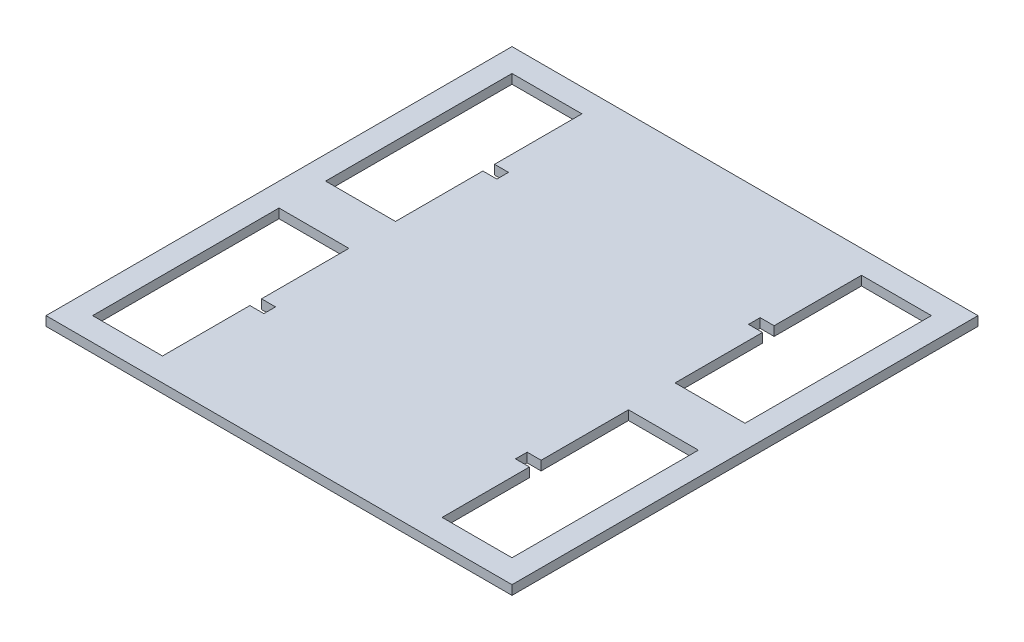
ISO-10303-21;
HEADER;
FILE_DESCRIPTION(('STEP AP214'),'2;1');
FILE_NAME('part.step','',(''),(''),'','','');
FILE_SCHEMA(('AUTOMOTIVE_DESIGN { 1 0 10303 214 1 1 1 1 }'));
ENDSEC;
DATA;
#1=APPLICATION_CONTEXT('core data for automotive mechanical design processes');
#2=APPLICATION_PROTOCOL_DEFINITION('international standard','automotive_design',2000,#1);
#3=PRODUCT_CONTEXT('',#1,'mechanical');
#4=PRODUCT('Part','Part','',(#3));
#5=PRODUCT_RELATED_PRODUCT_CATEGORY('part','',(#4));
#6=PRODUCT_DEFINITION_FORMATION('','',#4);
#7=PRODUCT_DEFINITION_CONTEXT('part definition',#1,'design');
#8=PRODUCT_DEFINITION('design','',#6,#7);
#9=PRODUCT_DEFINITION_SHAPE('','',#8);
#10=(LENGTH_UNIT() NAMED_UNIT(*) SI_UNIT(.MILLI.,.METRE.));
#11=(NAMED_UNIT(*) PLANE_ANGLE_UNIT() SI_UNIT($,.RADIAN.));
#12=(NAMED_UNIT(*) SI_UNIT($,.STERADIAN.) SOLID_ANGLE_UNIT());
#13=UNCERTAINTY_MEASURE_WITH_UNIT(LENGTH_MEASURE(1.E-05),#10,'distance_accuracy_value','');
#14=(GEOMETRIC_REPRESENTATION_CONTEXT(3) GLOBAL_UNCERTAINTY_ASSIGNED_CONTEXT((#13)) GLOBAL_UNIT_ASSIGNED_CONTEXT((#10,
#11,#12)) REPRESENTATION_CONTEXT('',''));
#15=CARTESIAN_POINT('',(0.,0.,0.));
#16=DIRECTION('',(0.,0.,1.));
#17=DIRECTION('',(1.,0.,0.));
#18=AXIS2_PLACEMENT_3D('',#15,#16,#17);
#19=CARTESIAN_POINT('',(0.,-8.,0.));
#20=DIRECTION('',(-1.,0.,0.));
#21=DIRECTION('',(0.,0.,1.));
#22=AXIS2_PLACEMENT_3D('',#19,#20,#21);
#23=PLANE('',#22);
#24=DIRECTION('',(0.,0.,1.));
#25=VECTOR('',#24,1.);
#26=CARTESIAN_POINT('',(0.,0.,0.));
#27=LINE('',#26,#25);
#28=CARTESIAN_POINT('',(0.,0.,-400.));
#29=VERTEX_POINT('',#28);
#30=CARTESIAN_POINT('',(0.,0.,0.));
#31=VERTEX_POINT('',#30);
#32=EDGE_CURVE('E486',#29,#31,#27,.T.);
#33=ORIENTED_EDGE('',*,*,#32,.F.);
#34=DIRECTION('',(0.,1.,0.));
#35=VECTOR('',#34,1.);
#36=CARTESIAN_POINT('',(0.,-8.,-400.));
#37=LINE('',#36,#35);
#38=CARTESIAN_POINT('',(0.,-8.,-400.));
#39=VERTEX_POINT('',#38);
#40=EDGE_CURVE('E11',#39,#29,#37,.T.);
#41=ORIENTED_EDGE('',*,*,#40,.F.);
#42=DIRECTION('',(0.,0.,1.));
#43=VECTOR('',#42,1.);
#44=CARTESIAN_POINT('',(0.,-8.,0.));
#45=LINE('',#44,#43);
#46=CARTESIAN_POINT('',(0.,-8.,0.));
#47=VERTEX_POINT('',#46);
#48=EDGE_CURVE('E487',#39,#47,#45,.T.);
#49=ORIENTED_EDGE('',*,*,#48,.T.);
#50=DIRECTION('',(0.,1.,0.));
#51=VECTOR('',#50,1.);
#52=CARTESIAN_POINT('',(0.,-8.,0.));
#53=LINE('',#52,#51);
#54=EDGE_CURVE('E42',#47,#31,#53,.T.);
#55=ORIENTED_EDGE('',*,*,#54,.T.);
#56=EDGE_LOOP('',(#33,#41,#49,#55));
#57=FACE_BOUND('',#56,.T.);
#58=ADVANCED_FACE('F39',(#57),#23,.T.);
#59=CARTESIAN_POINT('',(0.,-8.,-400.));
#60=DIRECTION('',(0.,0.,-1.));
#61=DIRECTION('',(-1.,0.,0.));
#62=AXIS2_PLACEMENT_3D('',#59,#60,#61);
#63=PLANE('',#62);
#64=DIRECTION('',(-1.,0.,0.));
#65=VECTOR('',#64,1.);
#66=CARTESIAN_POINT('',(0.,0.,-400.));
#67=LINE('',#66,#65);
#68=CARTESIAN_POINT('',(400.,0.,-400.));
#69=VERTEX_POINT('',#68);
#70=EDGE_CURVE('E491',#69,#29,#67,.T.);
#71=ORIENTED_EDGE('',*,*,#70,.F.);
#72=DIRECTION('',(0.,1.,0.));
#73=VECTOR('',#72,1.);
#74=CARTESIAN_POINT('',(400.,-8.,-400.));
#75=LINE('',#74,#73);
#76=CARTESIAN_POINT('',(400.,-8.,-400.));
#77=VERTEX_POINT('',#76);
#78=EDGE_CURVE('E47',#77,#69,#75,.T.);
#79=ORIENTED_EDGE('',*,*,#78,.F.);
#80=DIRECTION('',(-1.,0.,0.));
#81=VECTOR('',#80,1.);
#82=CARTESIAN_POINT('',(0.,-8.,-400.));
#83=LINE('',#82,#81);
#84=EDGE_CURVE('E497',#77,#39,#83,.T.);
#85=ORIENTED_EDGE('',*,*,#84,.T.);
#86=ORIENTED_EDGE('',*,*,#40,.T.);
#87=EDGE_LOOP('',(#71,#79,#85,#86));
#88=FACE_BOUND('',#87,.T.);
#89=ADVANCED_FACE('F522',(#88),#63,.T.);
#90=CARTESIAN_POINT('',(400.,-8.,0.));
#91=DIRECTION('',(1.,0.,0.));
#92=DIRECTION('',(0.,0.,-1.));
#93=AXIS2_PLACEMENT_3D('',#90,#91,#92);
#94=PLANE('',#93);
#95=DIRECTION('',(0.,0.,-1.));
#96=VECTOR('',#95,1.);
#97=CARTESIAN_POINT('',(400.,0.,0.));
#98=LINE('',#97,#96);
#99=CARTESIAN_POINT('',(400.,0.,0.));
#100=VERTEX_POINT('',#99);
#101=EDGE_CURVE('E505',#100,#69,#98,.T.);
#102=ORIENTED_EDGE('',*,*,#101,.F.);
#103=DIRECTION('',(0.,1.,0.));
#104=VECTOR('',#103,1.);
#105=CARTESIAN_POINT('',(400.,-8.,0.));
#106=LINE('',#105,#104);
#107=CARTESIAN_POINT('',(400.,-8.,0.));
#108=VERTEX_POINT('',#107);
#109=EDGE_CURVE('E510',#108,#100,#106,.T.);
#110=ORIENTED_EDGE('',*,*,#109,.F.);
#111=DIRECTION('',(0.,0.,-1.));
#112=VECTOR('',#111,1.);
#113=CARTESIAN_POINT('',(400.,-8.,0.));
#114=LINE('',#113,#112);
#115=EDGE_CURVE('E494',#108,#77,#114,.T.);
#116=ORIENTED_EDGE('',*,*,#115,.T.);
#117=ORIENTED_EDGE('',*,*,#78,.T.);
#118=EDGE_LOOP('',(#102,#110,#116,#117));
#119=FACE_BOUND('',#118,.T.);
#120=ADVANCED_FACE('F528',(#119),#94,.T.);
#121=CARTESIAN_POINT('',(0.,-8.,0.));
#122=DIRECTION('',(0.,0.,1.));
#123=DIRECTION('',(1.,0.,0.));
#124=AXIS2_PLACEMENT_3D('',#121,#122,#123);
#125=PLANE('',#124);
#126=DIRECTION('',(1.,0.,0.));
#127=VECTOR('',#126,1.);
#128=CARTESIAN_POINT('',(0.,0.,0.));
#129=LINE('',#128,#127);
#130=EDGE_CURVE('E502',#31,#100,#129,.T.);
#131=ORIENTED_EDGE('',*,*,#130,.F.);
#132=ORIENTED_EDGE('',*,*,#54,.F.);
#133=DIRECTION('',(1.,0.,0.));
#134=VECTOR('',#133,1.);
#135=CARTESIAN_POINT('',(0.,-8.,0.));
#136=LINE('',#135,#134);
#137=EDGE_CURVE('E490',#47,#108,#136,.T.);
#138=ORIENTED_EDGE('',*,*,#137,.T.);
#139=ORIENTED_EDGE('',*,*,#109,.T.);
#140=EDGE_LOOP('',(#131,#132,#138,#139));
#141=FACE_BOUND('',#140,.T.);
#142=ADVANCED_FACE('F518',(#141),#125,.T.);
#143=CARTESIAN_POINT('',(0.,-8.,0.));
#144=DIRECTION('',(0.,-1.,0.));
#145=DIRECTION('',(0.,0.,-1.));
#146=AXIS2_PLACEMENT_3D('',#143,#144,#145);
#147=PLANE('',#146);
#148=DIRECTION('',(0.,0.,-1.));
#149=VECTOR('',#148,1.);
#150=CARTESIAN_POINT('',(320.,-8.,0.));
#151=LINE('',#150,#149);
#152=CARTESIAN_POINT('',(320.,-8.,-20.));
#153=VERTEX_POINT('',#152);
#154=CARTESIAN_POINT('',(320.,-8.,-95.));
#155=VERTEX_POINT('',#154);
#156=EDGE_CURVE('E484',#153,#155,#151,.T.);
#157=ORIENTED_EDGE('',*,*,#156,.F.);
#158=DIRECTION('',(-1.,0.,0.));
#159=VECTOR('',#158,1.);
#160=CARTESIAN_POINT('',(0.,-8.,-20.));
#161=LINE('',#160,#159);
#162=CARTESIAN_POINT('',(380.,-8.,-20.));
#163=VERTEX_POINT('',#162);
#164=EDGE_CURVE('E470',#163,#153,#161,.T.);
#165=ORIENTED_EDGE('',*,*,#164,.F.);
#166=DIRECTION('',(0.,0.,1.));
#167=VECTOR('',#166,1.);
#168=CARTESIAN_POINT('',(380.,-8.,-2.63677968348475E-13));
#169=LINE('',#168,#167);
#170=CARTESIAN_POINT('',(380.,-8.,-180.));
#171=VERTEX_POINT('',#170);
#172=EDGE_CURVE('E472',#171,#163,#169,.T.);
#173=ORIENTED_EDGE('',*,*,#172,.F.);
#174=DIRECTION('',(1.,0.,0.));
#175=VECTOR('',#174,1.);
#176=CARTESIAN_POINT('',(0.,-8.,-180.));
#177=LINE('',#176,#175);
#178=CARTESIAN_POINT('',(320.,-8.,-180.));
#179=VERTEX_POINT('',#178);
#180=EDGE_CURVE('E474',#179,#171,#177,.T.);
#181=ORIENTED_EDGE('',*,*,#180,.F.);
#182=DIRECTION('',(0.,0.,-1.));
#183=VECTOR('',#182,1.);
#184=CARTESIAN_POINT('',(320.,-8.,-2.368475785867E-13));
#185=LINE('',#184,#183);
#186=CARTESIAN_POINT('',(320.,-8.,-105.));
#187=VERTEX_POINT('',#186);
#188=EDGE_CURVE('E476',#187,#179,#185,.T.);
#189=ORIENTED_EDGE('',*,*,#188,.F.);
#190=DIRECTION('',(1.,0.,0.));
#191=VECTOR('',#190,1.);
#192=CARTESIAN_POINT('',(2.42861286636755E-13,-8.,-105.000000000001));
#193=LINE('',#192,#191);
#194=CARTESIAN_POINT('',(308.,-8.,-105.));
#195=VERTEX_POINT('',#194);
#196=EDGE_CURVE('E478',#195,#187,#193,.T.);
#197=ORIENTED_EDGE('',*,*,#196,.F.);
#198=DIRECTION('',(0.,0.,-1.));
#199=VECTOR('',#198,1.);
#200=CARTESIAN_POINT('',(308.,-8.,0.));
#201=LINE('',#200,#199);
#202=CARTESIAN_POINT('',(308.,-8.,-95.));
#203=VERTEX_POINT('',#202);
#204=EDGE_CURVE('E480',#203,#195,#201,.T.);
#205=ORIENTED_EDGE('',*,*,#204,.F.);
#206=DIRECTION('',(-1.,0.,0.));
#207=VECTOR('',#206,1.);
#208=CARTESIAN_POINT('',(-4.39463280580784E-13,-8.,-94.9999999999986));
#209=LINE('',#208,#207);
#210=EDGE_CURVE('E482',#155,#203,#209,.T.);
#211=ORIENTED_EDGE('',*,*,#210,.F.);
#212=EDGE_LOOP('',(#157,#165,#173,#181,#189,#197,#205,#211));
#213=FACE_BOUND('',#212,.T.);
#214=DIRECTION('',(0.,0.,-1.));
#215=VECTOR('',#214,1.);
#216=CARTESIAN_POINT('',(320.,-8.,-2.368475785867E-13));
#217=LINE('',#216,#215);
#218=CARTESIAN_POINT('',(320.,-8.,-220.));
#219=VERTEX_POINT('',#218);
#220=CARTESIAN_POINT('',(320.,-8.,-295.));
#221=VERTEX_POINT('',#220);
#222=EDGE_CURVE('E468',#219,#221,#217,.T.);
#223=ORIENTED_EDGE('',*,*,#222,.F.);
#224=DIRECTION('',(-1.,0.,0.));
#225=VECTOR('',#224,1.);
#226=CARTESIAN_POINT('',(0.,-8.,-220.));
#227=LINE('',#226,#225);
#228=CARTESIAN_POINT('',(380.,-8.,-220.));
#229=VERTEX_POINT('',#228);
#230=EDGE_CURVE('E454',#229,#219,#227,.T.);
#231=ORIENTED_EDGE('',*,*,#230,.F.);
#232=DIRECTION('',(0.,0.,1.));
#233=VECTOR('',#232,1.);
#234=CARTESIAN_POINT('',(380.,-8.,0.));
#235=LINE('',#234,#233);
#236=CARTESIAN_POINT('',(380.,-8.,-380.));
#237=VERTEX_POINT('',#236);
#238=EDGE_CURVE('E456',#237,#229,#235,.T.);
#239=ORIENTED_EDGE('',*,*,#238,.F.);
#240=DIRECTION('',(1.,0.,0.));
#241=VECTOR('',#240,1.);
#242=CARTESIAN_POINT('',(0.,-8.,-380.));
#243=LINE('',#242,#241);
#244=CARTESIAN_POINT('',(320.,-8.,-380.));
#245=VERTEX_POINT('',#244);
#246=EDGE_CURVE('E458',#245,#237,#243,.T.);
#247=ORIENTED_EDGE('',*,*,#246,.F.);
#248=DIRECTION('',(0.,0.,-1.));
#249=VECTOR('',#248,1.);
#250=CARTESIAN_POINT('',(320.,-8.,0.));
#251=LINE('',#250,#249);
#252=CARTESIAN_POINT('',(320.,-8.,-305.));
#253=VERTEX_POINT('',#252);
#254=EDGE_CURVE('E460',#253,#245,#251,.T.);
#255=ORIENTED_EDGE('',*,*,#254,.F.);
#256=DIRECTION('',(1.,0.,0.));
#257=VECTOR('',#256,1.);
#258=CARTESIAN_POINT('',(0.,-8.,-305.));
#259=LINE('',#258,#257);
#260=CARTESIAN_POINT('',(308.,-8.,-305.));
#261=VERTEX_POINT('',#260);
#262=EDGE_CURVE('E462',#261,#253,#259,.T.);
#263=ORIENTED_EDGE('',*,*,#262,.F.);
#264=DIRECTION('',(0.,0.,-1.));
#265=VECTOR('',#264,1.);
#266=CARTESIAN_POINT('',(308.,-8.,0.));
#267=LINE('',#266,#265);
#268=CARTESIAN_POINT('',(308.,-8.,-295.));
#269=VERTEX_POINT('',#268);
#270=EDGE_CURVE('E464',#269,#261,#267,.T.);
#271=ORIENTED_EDGE('',*,*,#270,.F.);
#272=DIRECTION('',(-1.,0.,0.));
#273=VECTOR('',#272,1.);
#274=CARTESIAN_POINT('',(-2.72929826887017E-12,-8.,-294.999999999997));
#275=LINE('',#274,#273);
#276=EDGE_CURVE('E466',#221,#269,#275,.T.);
#277=ORIENTED_EDGE('',*,*,#276,.F.);
#278=EDGE_LOOP('',(#223,#231,#239,#247,#255,#263,#271,#277));
#279=FACE_BOUND('',#278,.T.);
#280=DIRECTION('',(0.,0.,-1.));
#281=VECTOR('',#280,1.);
#282=CARTESIAN_POINT('',(20.,-8.,0.));
#283=LINE('',#282,#281);
#284=CARTESIAN_POINT('',(20.,-8.,-220.));
#285=VERTEX_POINT('',#284);
#286=CARTESIAN_POINT('',(19.9999999999999,-8.,-380.));
#287=VERTEX_POINT('',#286);
#288=EDGE_CURVE('E279',#285,#287,#283,.T.);
#289=ORIENTED_EDGE('',*,*,#288,.F.);
#290=DIRECTION('',(-1.,0.,0.));
#291=VECTOR('',#290,1.);
#292=CARTESIAN_POINT('',(0.,-8.,-220.));
#293=LINE('',#292,#291);
#294=CARTESIAN_POINT('',(80.,-8.,-220.));
#295=VERTEX_POINT('',#294);
#296=EDGE_CURVE('E438',#295,#285,#293,.T.);
#297=ORIENTED_EDGE('',*,*,#296,.F.);
#298=DIRECTION('',(0.,0.,1.));
#299=VECTOR('',#298,1.);
#300=CARTESIAN_POINT('',(80.,-8.,0.));
#301=LINE('',#300,#299);
#302=CARTESIAN_POINT('',(80.,-8.,-295.));
#303=VERTEX_POINT('',#302);
#304=EDGE_CURVE('E440',#303,#295,#301,.T.);
#305=ORIENTED_EDGE('',*,*,#304,.F.);
#306=DIRECTION('',(-1.,0.,0.));
#307=VECTOR('',#306,1.);
#308=CARTESIAN_POINT('',(0.,-8.,-295.));
#309=LINE('',#308,#307);
#310=CARTESIAN_POINT('',(92.,-8.,-295.));
#311=VERTEX_POINT('',#310);
#312=EDGE_CURVE('E443',#311,#303,#309,.T.);
#313=ORIENTED_EDGE('',*,*,#312,.F.);
#314=DIRECTION('',(0.,0.,1.));
#315=VECTOR('',#314,1.);
#316=CARTESIAN_POINT('',(92.,-8.,0.));
#317=LINE('',#316,#315);
#318=CARTESIAN_POINT('',(92.,-8.,-305.));
#319=VERTEX_POINT('',#318);
#320=EDGE_CURVE('E445',#319,#311,#317,.T.);
#321=ORIENTED_EDGE('',*,*,#320,.F.);
#322=DIRECTION('',(1.,0.,0.));
#323=VECTOR('',#322,1.);
#324=CARTESIAN_POINT('',(0.,-8.,-305.));
#325=LINE('',#324,#323);
#326=CARTESIAN_POINT('',(80.,-8.,-305.));
#327=VERTEX_POINT('',#326);
#328=EDGE_CURVE('E447',#327,#319,#325,.T.);
#329=ORIENTED_EDGE('',*,*,#328,.F.);
#330=DIRECTION('',(0.,0.,1.));
#331=VECTOR('',#330,1.);
#332=CARTESIAN_POINT('',(80.,-8.,0.));
#333=LINE('',#332,#331);
#334=CARTESIAN_POINT('',(79.9999999999999,-8.,-380.));
#335=VERTEX_POINT('',#334);
#336=EDGE_CURVE('E449',#335,#327,#333,.T.);
#337=ORIENTED_EDGE('',*,*,#336,.F.);
#338=DIRECTION('',(1.,0.,0.));
#339=VECTOR('',#338,1.);
#340=CARTESIAN_POINT('',(0.,-8.,-380.));
#341=LINE('',#340,#339);
#342=EDGE_CURVE('E451',#287,#335,#341,.T.);
#343=ORIENTED_EDGE('',*,*,#342,.F.);
#344=EDGE_LOOP('',(#289,#297,#305,#313,#321,#329,#337,#343));
#345=FACE_BOUND('',#344,.T.);
#346=DIRECTION('',(0.,0.,1.));
#347=VECTOR('',#346,1.);
#348=CARTESIAN_POINT('',(80.,-8.,0.));
#349=LINE('',#348,#347);
#350=CARTESIAN_POINT('',(80.,-8.,-180.));
#351=VERTEX_POINT('',#350);
#352=CARTESIAN_POINT('',(80.,-8.,-105.));
#353=VERTEX_POINT('',#352);
#354=EDGE_CURVE('E436',#351,#353,#349,.T.);
#355=ORIENTED_EDGE('',*,*,#354,.F.);
#356=DIRECTION('',(1.,0.,0.));
#357=VECTOR('',#356,1.);
#358=CARTESIAN_POINT('',(0.,-8.,-180.));
#359=LINE('',#358,#357);
#360=CARTESIAN_POINT('',(20.,-8.,-180.));
#361=VERTEX_POINT('',#360);
#362=EDGE_CURVE('E407',#361,#351,#359,.T.);
#363=ORIENTED_EDGE('',*,*,#362,.F.);
#364=DIRECTION('',(0.,0.,-1.));
#365=VECTOR('',#364,1.);
#366=CARTESIAN_POINT('',(19.9999999999999,-8.,0.));
#367=LINE('',#366,#365);
#368=CARTESIAN_POINT('',(19.9999999999999,-8.,-20.));
#369=VERTEX_POINT('',#368);
#370=EDGE_CURVE('E423',#369,#361,#367,.T.);
#371=ORIENTED_EDGE('',*,*,#370,.F.);
#372=DIRECTION('',(-1.,0.,0.));
#373=VECTOR('',#372,1.);
#374=CARTESIAN_POINT('',(0.,-8.,-20.));
#375=LINE('',#374,#373);
#376=CARTESIAN_POINT('',(79.9999999999999,-8.,-20.));
#377=VERTEX_POINT('',#376);
#378=EDGE_CURVE('E426',#377,#369,#375,.T.);
#379=ORIENTED_EDGE('',*,*,#378,.F.);
#380=DIRECTION('',(0.,0.,1.));
#381=VECTOR('',#380,1.);
#382=CARTESIAN_POINT('',(79.9999999999999,-8.,0.));
#383=LINE('',#382,#381);
#384=CARTESIAN_POINT('',(80.,-8.,-95.));
#385=VERTEX_POINT('',#384);
#386=EDGE_CURVE('E428',#385,#377,#383,.T.);
#387=ORIENTED_EDGE('',*,*,#386,.F.);
#388=DIRECTION('',(-1.,0.,0.));
#389=VECTOR('',#388,1.);
#390=CARTESIAN_POINT('',(0.,-8.,-95.));
#391=LINE('',#390,#389);
#392=CARTESIAN_POINT('',(92.,-8.,-95.));
#393=VERTEX_POINT('',#392);
#394=EDGE_CURVE('E430',#393,#385,#391,.T.);
#395=ORIENTED_EDGE('',*,*,#394,.F.);
#396=DIRECTION('',(0.,0.,1.));
#397=VECTOR('',#396,1.);
#398=CARTESIAN_POINT('',(92.,-8.,0.));
#399=LINE('',#398,#397);
#400=CARTESIAN_POINT('',(92.,-8.,-105.));
#401=VERTEX_POINT('',#400);
#402=EDGE_CURVE('E432',#401,#393,#399,.T.);
#403=ORIENTED_EDGE('',*,*,#402,.F.);
#404=DIRECTION('',(1.,0.,0.));
#405=VECTOR('',#404,1.);
#406=CARTESIAN_POINT('',(0.,-8.,-105.));
#407=LINE('',#406,#405);
#408=EDGE_CURVE('E434',#353,#401,#407,.T.);
#409=ORIENTED_EDGE('',*,*,#408,.F.);
#410=EDGE_LOOP('',(#355,#363,#371,#379,#387,#395,#403,#409));
#411=FACE_BOUND('',#410,.T.);
#412=ORIENTED_EDGE('',*,*,#48,.F.);
#413=ORIENTED_EDGE('',*,*,#84,.F.);
#414=ORIENTED_EDGE('',*,*,#115,.F.);
#415=ORIENTED_EDGE('',*,*,#137,.F.);
#416=EDGE_LOOP('',(#412,#413,#414,#415));
#417=FACE_BOUND('',#416,.T.);
#418=ADVANCED_FACE('F525',(#213,#279,#345,#411,#417),#147,.T.);
#419=CARTESIAN_POINT('',(0.,0.,0.));
#420=DIRECTION('',(0.,-1.,0.));
#421=DIRECTION('',(0.,0.,-1.));
#422=AXIS2_PLACEMENT_3D('',#419,#420,#421);
#423=PLANE('',#422);
#424=DIRECTION('',(1.,0.,0.));
#425=VECTOR('',#424,1.);
#426=CARTESIAN_POINT('',(320.,0.,-20.));
#427=LINE('',#426,#425);
#428=CARTESIAN_POINT('',(320.,0.,-20.));
#429=VERTEX_POINT('',#428);
#430=CARTESIAN_POINT('',(380.,0.,-20.));
#431=VERTEX_POINT('',#430);
#432=EDGE_CURVE('E381',#429,#431,#427,.T.);
#433=ORIENTED_EDGE('',*,*,#432,.F.);
#434=DIRECTION('',(0.,0.,1.));
#435=VECTOR('',#434,1.);
#436=CARTESIAN_POINT('',(320.,0.,-20.));
#437=LINE('',#436,#435);
#438=CARTESIAN_POINT('',(320.,0.,-95.));
#439=VERTEX_POINT('',#438);
#440=EDGE_CURVE('E326',#439,#429,#437,.T.);
#441=ORIENTED_EDGE('',*,*,#440,.F.);
#442=DIRECTION('',(1.,0.,0.));
#443=VECTOR('',#442,1.);
#444=CARTESIAN_POINT('',(308.,0.,-95.));
#445=LINE('',#444,#443);
#446=CARTESIAN_POINT('',(308.,0.,-95.));
#447=VERTEX_POINT('',#446);
#448=EDGE_CURVE('E350',#447,#439,#445,.T.);
#449=ORIENTED_EDGE('',*,*,#448,.F.);
#450=DIRECTION('',(0.,0.,1.));
#451=VECTOR('',#450,1.);
#452=CARTESIAN_POINT('',(308.,0.,-95.));
#453=LINE('',#452,#451);
#454=CARTESIAN_POINT('',(308.,0.,-105.));
#455=VERTEX_POINT('',#454);
#456=EDGE_CURVE('E366',#455,#447,#453,.T.);
#457=ORIENTED_EDGE('',*,*,#456,.F.);
#458=DIRECTION('',(-1.,0.,0.));
#459=VECTOR('',#458,1.);
#460=CARTESIAN_POINT('',(308.,0.,-105.));
#461=LINE('',#460,#459);
#462=CARTESIAN_POINT('',(320.,0.,-105.));
#463=VERTEX_POINT('',#462);
#464=EDGE_CURVE('E369',#463,#455,#461,.T.);
#465=ORIENTED_EDGE('',*,*,#464,.F.);
#466=DIRECTION('',(0.,0.,1.));
#467=VECTOR('',#466,1.);
#468=CARTESIAN_POINT('',(320.,0.,-105.));
#469=LINE('',#468,#467);
#470=CARTESIAN_POINT('',(320.,0.,-180.));
#471=VERTEX_POINT('',#470);
#472=EDGE_CURVE('E372',#471,#463,#469,.T.);
#473=ORIENTED_EDGE('',*,*,#472,.F.);
#474=DIRECTION('',(-1.,0.,0.));
#475=VECTOR('',#474,1.);
#476=CARTESIAN_POINT('',(320.,0.,-180.));
#477=LINE('',#476,#475);
#478=CARTESIAN_POINT('',(380.,0.,-180.));
#479=VERTEX_POINT('',#478);
#480=EDGE_CURVE('E375',#479,#471,#477,.T.);
#481=ORIENTED_EDGE('',*,*,#480,.F.);
#482=DIRECTION('',(0.,0.,-1.));
#483=VECTOR('',#482,1.);
#484=CARTESIAN_POINT('',(380.,0.,-20.));
#485=LINE('',#484,#483);
#486=EDGE_CURVE('E378',#431,#479,#485,.T.);
#487=ORIENTED_EDGE('',*,*,#486,.F.);
#488=EDGE_LOOP('',(#433,#441,#449,#457,#465,#473,#481,#487));
#489=FACE_BOUND('',#488,.T.);
#490=DIRECTION('',(1.,0.,0.));
#491=VECTOR('',#490,1.);
#492=CARTESIAN_POINT('',(320.,0.,-220.));
#493=LINE('',#492,#491);
#494=CARTESIAN_POINT('',(320.,0.,-220.));
#495=VERTEX_POINT('',#494);
#496=CARTESIAN_POINT('',(380.,0.,-220.));
#497=VERTEX_POINT('',#496);
#498=EDGE_CURVE('E344',#495,#497,#493,.T.);
#499=ORIENTED_EDGE('',*,*,#498,.F.);
#500=DIRECTION('',(0.,0.,1.));
#501=VECTOR('',#500,1.);
#502=CARTESIAN_POINT('',(320.,0.,-295.));
#503=LINE('',#502,#501);
#504=CARTESIAN_POINT('',(320.,0.,-295.));
#505=VERTEX_POINT('',#504);
#506=EDGE_CURVE('E283',#505,#495,#503,.T.);
#507=ORIENTED_EDGE('',*,*,#506,.F.);
#508=DIRECTION('',(1.,0.,0.));
#509=VECTOR('',#508,1.);
#510=CARTESIAN_POINT('',(308.,0.,-295.));
#511=LINE('',#510,#509);
#512=CARTESIAN_POINT('',(308.,0.,-295.));
#513=VERTEX_POINT('',#512);
#514=EDGE_CURVE('E312',#513,#505,#511,.T.);
#515=ORIENTED_EDGE('',*,*,#514,.F.);
#516=DIRECTION('',(0.,0.,1.));
#517=VECTOR('',#516,1.);
#518=CARTESIAN_POINT('',(308.,0.,-305.));
#519=LINE('',#518,#517);
#520=CARTESIAN_POINT('',(308.,0.,-305.));
#521=VERTEX_POINT('',#520);
#522=EDGE_CURVE('E329',#521,#513,#519,.T.);
#523=ORIENTED_EDGE('',*,*,#522,.F.);
#524=DIRECTION('',(-1.,0.,0.));
#525=VECTOR('',#524,1.);
#526=CARTESIAN_POINT('',(308.,0.,-305.));
#527=LINE('',#526,#525);
#528=CARTESIAN_POINT('',(320.,0.,-305.));
#529=VERTEX_POINT('',#528);
#530=EDGE_CURVE('E332',#529,#521,#527,.T.);
#531=ORIENTED_EDGE('',*,*,#530,.F.);
#532=DIRECTION('',(0.,0.,1.));
#533=VECTOR('',#532,1.);
#534=CARTESIAN_POINT('',(320.,0.,-380.));
#535=LINE('',#534,#533);
#536=CARTESIAN_POINT('',(320.,0.,-380.));
#537=VERTEX_POINT('',#536);
#538=EDGE_CURVE('E335',#537,#529,#535,.T.);
#539=ORIENTED_EDGE('',*,*,#538,.F.);
#540=DIRECTION('',(-1.,0.,0.));
#541=VECTOR('',#540,1.);
#542=CARTESIAN_POINT('',(320.,0.,-380.));
#543=LINE('',#542,#541);
#544=CARTESIAN_POINT('',(380.,0.,-380.));
#545=VERTEX_POINT('',#544);
#546=EDGE_CURVE('E338',#545,#537,#543,.T.);
#547=ORIENTED_EDGE('',*,*,#546,.F.);
#548=DIRECTION('',(0.,0.,-1.));
#549=VECTOR('',#548,1.);
#550=CARTESIAN_POINT('',(380.,0.,-380.));
#551=LINE('',#550,#549);
#552=EDGE_CURVE('E341',#497,#545,#551,.T.);
#553=ORIENTED_EDGE('',*,*,#552,.F.);
#554=EDGE_LOOP('',(#499,#507,#515,#523,#531,#539,#547,#553));
#555=FACE_BOUND('',#554,.T.);
#556=DIRECTION('',(1.,0.,0.));
#557=VECTOR('',#556,1.);
#558=CARTESIAN_POINT('',(80.,0.,-220.));
#559=LINE('',#558,#557);
#560=CARTESIAN_POINT('',(20.,0.,-220.));
#561=VERTEX_POINT('',#560);
#562=CARTESIAN_POINT('',(80.,0.,-220.));
#563=VERTEX_POINT('',#562);
#564=EDGE_CURVE('E300',#561,#563,#559,.T.);
#565=ORIENTED_EDGE('',*,*,#564,.F.);
#566=DIRECTION('',(0.,0.,1.));
#567=VECTOR('',#566,1.);
#568=CARTESIAN_POINT('',(19.9999999999999,0.,-380.));
#569=LINE('',#568,#567);
#570=CARTESIAN_POINT('',(19.9999999999999,0.,-380.));
#571=VERTEX_POINT('',#570);
#572=EDGE_CURVE('E276',#571,#561,#569,.T.);
#573=ORIENTED_EDGE('',*,*,#572,.F.);
#574=DIRECTION('',(-1.,0.,0.));
#575=VECTOR('',#574,1.);
#576=CARTESIAN_POINT('',(79.9999999999999,0.,-380.));
#577=LINE('',#576,#575);
#578=CARTESIAN_POINT('',(79.9999999999999,0.,-380.));
#579=VERTEX_POINT('',#578);
#580=EDGE_CURVE('E286',#579,#571,#577,.T.);
#581=ORIENTED_EDGE('',*,*,#580,.F.);
#582=DIRECTION('',(0.,0.,-1.));
#583=VECTOR('',#582,1.);
#584=CARTESIAN_POINT('',(79.9999999999999,0.,-380.));
#585=LINE('',#584,#583);
#586=CARTESIAN_POINT('',(80.,0.,-305.));
#587=VERTEX_POINT('',#586);
#588=EDGE_CURVE('E292',#587,#579,#585,.T.);
#589=ORIENTED_EDGE('',*,*,#588,.F.);
#590=DIRECTION('',(-1.,0.,0.));
#591=VECTOR('',#590,1.);
#592=CARTESIAN_POINT('',(92.,0.,-305.));
#593=LINE('',#592,#591);
#594=CARTESIAN_POINT('',(92.,0.,-305.));
#595=VERTEX_POINT('',#594);
#596=EDGE_CURVE('E1128',#595,#587,#593,.T.);
#597=ORIENTED_EDGE('',*,*,#596,.F.);
#598=DIRECTION('',(0.,0.,-1.));
#599=VECTOR('',#598,1.);
#600=CARTESIAN_POINT('',(92.,0.,-305.));
#601=LINE('',#600,#599);
#602=CARTESIAN_POINT('',(92.,0.,-295.));
#603=VERTEX_POINT('',#602);
#604=EDGE_CURVE('E1131',#603,#595,#601,.T.);
#605=ORIENTED_EDGE('',*,*,#604,.F.);
#606=DIRECTION('',(1.,0.,0.));
#607=VECTOR('',#606,1.);
#608=CARTESIAN_POINT('',(92.,0.,-295.));
#609=LINE('',#608,#607);
#610=CARTESIAN_POINT('',(80.,0.,-295.));
#611=VERTEX_POINT('',#610);
#612=EDGE_CURVE('E1134',#611,#603,#609,.T.);
#613=ORIENTED_EDGE('',*,*,#612,.F.);
#614=DIRECTION('',(0.,0.,-1.));
#615=VECTOR('',#614,1.);
#616=CARTESIAN_POINT('',(80.,0.,-295.));
#617=LINE('',#616,#615);
#618=EDGE_CURVE('E305',#563,#611,#617,.T.);
#619=ORIENTED_EDGE('',*,*,#618,.F.);
#620=EDGE_LOOP('',(#565,#573,#581,#589,#597,#605,#613,#619));
#621=FACE_BOUND('',#620,.T.);
#622=DIRECTION('',(-1.,0.,0.));
#623=VECTOR('',#622,1.);
#624=CARTESIAN_POINT('',(80.,0.,-180.));
#625=LINE('',#624,#623);
#626=CARTESIAN_POINT('',(80.,0.,-180.));
#627=VERTEX_POINT('',#626);
#628=CARTESIAN_POINT('',(20.,0.,-180.));
#629=VERTEX_POINT('',#628);
#630=EDGE_CURVE('E303',#627,#629,#625,.T.);
#631=ORIENTED_EDGE('',*,*,#630,.F.);
#632=DIRECTION('',(0.,0.,-1.));
#633=VECTOR('',#632,1.);
#634=CARTESIAN_POINT('',(80.,0.,-105.));
#635=LINE('',#634,#633);
#636=CARTESIAN_POINT('',(80.,0.,-105.));
#637=VERTEX_POINT('',#636);
#638=EDGE_CURVE('E301',#637,#627,#635,.T.);
#639=ORIENTED_EDGE('',*,*,#638,.F.);
#640=DIRECTION('',(-1.,0.,0.));
#641=VECTOR('',#640,1.);
#642=CARTESIAN_POINT('',(92.,0.,-105.));
#643=LINE('',#642,#641);
#644=CARTESIAN_POINT('',(92.,0.,-105.));
#645=VERTEX_POINT('',#644);
#646=EDGE_CURVE('E401',#645,#637,#643,.T.);
#647=ORIENTED_EDGE('',*,*,#646,.F.);
#648=DIRECTION('',(0.,0.,-1.));
#649=VECTOR('',#648,1.);
#650=CARTESIAN_POINT('',(92.,0.,-95.));
#651=LINE('',#650,#649);
#652=CARTESIAN_POINT('',(92.,0.,-95.));
#653=VERTEX_POINT('',#652);
#654=EDGE_CURVE('E398',#653,#645,#651,.T.);
#655=ORIENTED_EDGE('',*,*,#654,.F.);
#656=DIRECTION('',(1.,0.,0.));
#657=VECTOR('',#656,1.);
#658=CARTESIAN_POINT('',(92.,0.,-95.));
#659=LINE('',#658,#657);
#660=CARTESIAN_POINT('',(80.,0.,-95.));
#661=VERTEX_POINT('',#660);
#662=EDGE_CURVE('E395',#661,#653,#659,.T.);
#663=ORIENTED_EDGE('',*,*,#662,.F.);
#664=DIRECTION('',(0.,0.,-1.));
#665=VECTOR('',#664,1.);
#666=CARTESIAN_POINT('',(79.9999999999999,0.,-20.));
#667=LINE('',#666,#665);
#668=CARTESIAN_POINT('',(79.9999999999999,0.,-20.));
#669=VERTEX_POINT('',#668);
#670=EDGE_CURVE('E392',#669,#661,#667,.T.);
#671=ORIENTED_EDGE('',*,*,#670,.F.);
#672=DIRECTION('',(1.,0.,0.));
#673=VECTOR('',#672,1.);
#674=CARTESIAN_POINT('',(79.9999999999999,0.,-20.));
#675=LINE('',#674,#673);
#676=CARTESIAN_POINT('',(19.9999999999999,0.,-20.));
#677=VERTEX_POINT('',#676);
#678=EDGE_CURVE('E389',#677,#669,#675,.T.);
#679=ORIENTED_EDGE('',*,*,#678,.F.);
#680=DIRECTION('',(0.,0.,1.));
#681=VECTOR('',#680,1.);
#682=CARTESIAN_POINT('',(19.9999999999999,0.,-20.));
#683=LINE('',#682,#681);
#684=EDGE_CURVE('E386',#629,#677,#683,.T.);
#685=ORIENTED_EDGE('',*,*,#684,.F.);
#686=EDGE_LOOP('',(#631,#639,#647,#655,#663,#671,#679,#685));
#687=FACE_BOUND('',#686,.T.);
#688=ORIENTED_EDGE('',*,*,#32,.T.);
#689=ORIENTED_EDGE('',*,*,#130,.T.);
#690=ORIENTED_EDGE('',*,*,#101,.T.);
#691=ORIENTED_EDGE('',*,*,#70,.T.);
#692=EDGE_LOOP('',(#688,#689,#690,#691));
#693=FACE_BOUND('',#692,.T.);
#694=ADVANCED_FACE('F296',(#489,#555,#621,#687,#693),#423,.F.);
#695=CARTESIAN_POINT('',(80.,-10.,-105.));
#696=DIRECTION('',(1.,0.,0.));
#697=DIRECTION('',(0.,0.,-1.));
#698=AXIS2_PLACEMENT_3D('',#695,#696,#697);
#699=PLANE('',#698);
#700=ORIENTED_EDGE('',*,*,#354,.T.);
#701=DIRECTION('',(0.,1.,0.));
#702=VECTOR('',#701,1.);
#703=CARTESIAN_POINT('',(80.,-10.,-105.));
#704=LINE('',#703,#702);
#705=EDGE_CURVE('E405',#353,#637,#704,.T.);
#706=ORIENTED_EDGE('',*,*,#705,.T.);
#707=ORIENTED_EDGE('',*,*,#638,.T.);
#708=DIRECTION('',(0.,1.,0.));
#709=VECTOR('',#708,1.);
#710=CARTESIAN_POINT('',(80.,-10.,-180.));
#711=LINE('',#710,#709);
#712=EDGE_CURVE('E404',#351,#627,#711,.T.);
#713=ORIENTED_EDGE('',*,*,#712,.F.);
#714=EDGE_LOOP('',(#700,#706,#707,#713));
#715=FACE_BOUND('',#714,.T.);
#716=ADVANCED_FACE('F575',(#715),#699,.F.);
#717=CARTESIAN_POINT('',(92.,-10.,-105.));
#718=DIRECTION('',(0.,0.,-1.));
#719=DIRECTION('',(-1.,0.,0.));
#720=AXIS2_PLACEMENT_3D('',#717,#718,#719);
#721=PLANE('',#720);
#722=ORIENTED_EDGE('',*,*,#408,.T.);
#723=DIRECTION('',(0.,1.,0.));
#724=VECTOR('',#723,1.);
#725=CARTESIAN_POINT('',(92.,-10.,-105.));
#726=LINE('',#725,#724);
#727=EDGE_CURVE('E408',#401,#645,#726,.T.);
#728=ORIENTED_EDGE('',*,*,#727,.T.);
#729=ORIENTED_EDGE('',*,*,#646,.T.);
#730=ORIENTED_EDGE('',*,*,#705,.F.);
#731=EDGE_LOOP('',(#722,#728,#729,#730));
#732=FACE_BOUND('',#731,.T.);
#733=ADVANCED_FACE('F586',(#732),#721,.F.);
#734=CARTESIAN_POINT('',(92.,-10.,-95.));
#735=DIRECTION('',(1.,0.,0.));
#736=DIRECTION('',(0.,0.,-1.));
#737=AXIS2_PLACEMENT_3D('',#734,#735,#736);
#738=PLANE('',#737);
#739=ORIENTED_EDGE('',*,*,#402,.T.);
#740=DIRECTION('',(0.,1.,0.));
#741=VECTOR('',#740,1.);
#742=CARTESIAN_POINT('',(92.,-10.,-95.));
#743=LINE('',#742,#741);
#744=EDGE_CURVE('E410',#393,#653,#743,.T.);
#745=ORIENTED_EDGE('',*,*,#744,.T.);
#746=ORIENTED_EDGE('',*,*,#654,.T.);
#747=ORIENTED_EDGE('',*,*,#727,.F.);
#748=EDGE_LOOP('',(#739,#745,#746,#747));
#749=FACE_BOUND('',#748,.T.);
#750=ADVANCED_FACE('F597',(#749),#738,.F.);
#751=CARTESIAN_POINT('',(92.,-10.,-95.));
#752=DIRECTION('',(0.,0.,1.));
#753=DIRECTION('',(1.,0.,0.));
#754=AXIS2_PLACEMENT_3D('',#751,#752,#753);
#755=PLANE('',#754);
#756=ORIENTED_EDGE('',*,*,#394,.T.);
#757=DIRECTION('',(0.,1.,0.));
#758=VECTOR('',#757,1.);
#759=CARTESIAN_POINT('',(80.,-10.,-95.));
#760=LINE('',#759,#758);
#761=EDGE_CURVE('E412',#385,#661,#760,.T.);
#762=ORIENTED_EDGE('',*,*,#761,.T.);
#763=ORIENTED_EDGE('',*,*,#662,.T.);
#764=ORIENTED_EDGE('',*,*,#744,.F.);
#765=EDGE_LOOP('',(#756,#762,#763,#764));
#766=FACE_BOUND('',#765,.T.);
#767=ADVANCED_FACE('F608',(#766),#755,.F.);
#768=CARTESIAN_POINT('',(79.9999999999999,-10.,-20.));
#769=DIRECTION('',(1.,0.,0.));
#770=DIRECTION('',(0.,0.,-1.));
#771=AXIS2_PLACEMENT_3D('',#768,#769,#770);
#772=PLANE('',#771);
#773=ORIENTED_EDGE('',*,*,#386,.T.);
#774=DIRECTION('',(0.,1.,0.));
#775=VECTOR('',#774,1.);
#776=CARTESIAN_POINT('',(79.9999999999999,-10.,-20.));
#777=LINE('',#776,#775);
#778=EDGE_CURVE('E414',#377,#669,#777,.T.);
#779=ORIENTED_EDGE('',*,*,#778,.T.);
#780=ORIENTED_EDGE('',*,*,#670,.T.);
#781=ORIENTED_EDGE('',*,*,#761,.F.);
#782=EDGE_LOOP('',(#773,#779,#780,#781));
#783=FACE_BOUND('',#782,.T.);
#784=ADVANCED_FACE('F619',(#783),#772,.F.);
#785=CARTESIAN_POINT('',(79.9999999999999,-10.,-20.));
#786=DIRECTION('',(0.,0.,1.));
#787=DIRECTION('',(1.,0.,0.));
#788=AXIS2_PLACEMENT_3D('',#785,#786,#787);
#789=PLANE('',#788);
#790=ORIENTED_EDGE('',*,*,#378,.T.);
#791=DIRECTION('',(0.,1.,0.));
#792=VECTOR('',#791,1.);
#793=CARTESIAN_POINT('',(19.9999999999999,-10.,-20.));
#794=LINE('',#793,#792);
#795=EDGE_CURVE('E416',#369,#677,#794,.T.);
#796=ORIENTED_EDGE('',*,*,#795,.T.);
#797=ORIENTED_EDGE('',*,*,#678,.T.);
#798=ORIENTED_EDGE('',*,*,#778,.F.);
#799=EDGE_LOOP('',(#790,#796,#797,#798));
#800=FACE_BOUND('',#799,.T.);
#801=ADVANCED_FACE('F630',(#800),#789,.F.);
#802=CARTESIAN_POINT('',(19.9999999999999,-10.,-20.));
#803=DIRECTION('',(-1.,0.,0.));
#804=DIRECTION('',(0.,0.,1.));
#805=AXIS2_PLACEMENT_3D('',#802,#803,#804);
#806=PLANE('',#805);
#807=ORIENTED_EDGE('',*,*,#370,.T.);
#808=DIRECTION('',(0.,1.,0.));
#809=VECTOR('',#808,1.);
#810=CARTESIAN_POINT('',(20.,-10.,-180.));
#811=LINE('',#810,#809);
#812=EDGE_CURVE('E418',#361,#629,#811,.T.);
#813=ORIENTED_EDGE('',*,*,#812,.T.);
#814=ORIENTED_EDGE('',*,*,#684,.T.);
#815=ORIENTED_EDGE('',*,*,#795,.F.);
#816=EDGE_LOOP('',(#807,#813,#814,#815));
#817=FACE_BOUND('',#816,.T.);
#818=ADVANCED_FACE('F641',(#817),#806,.F.);
#819=CARTESIAN_POINT('',(80.,-10.,-180.));
#820=DIRECTION('',(0.,0.,-1.));
#821=DIRECTION('',(-1.,0.,0.));
#822=AXIS2_PLACEMENT_3D('',#819,#820,#821);
#823=PLANE('',#822);
#824=ORIENTED_EDGE('',*,*,#362,.T.);
#825=ORIENTED_EDGE('',*,*,#712,.T.);
#826=ORIENTED_EDGE('',*,*,#630,.T.);
#827=ORIENTED_EDGE('',*,*,#812,.F.);
#828=EDGE_LOOP('',(#824,#825,#826,#827));
#829=FACE_BOUND('',#828,.T.);
#830=ADVANCED_FACE('F652',(#829),#823,.F.);
#831=CARTESIAN_POINT('',(19.9999999999999,-10.,-380.));
#832=DIRECTION('',(-1.,0.,0.));
#833=DIRECTION('',(0.,0.,1.));
#834=AXIS2_PLACEMENT_3D('',#831,#832,#833);
#835=PLANE('',#834);
#836=ORIENTED_EDGE('',*,*,#288,.T.);
#837=DIRECTION('',(0.,1.,0.));
#838=VECTOR('',#837,1.);
#839=CARTESIAN_POINT('',(19.9999999999999,-10.,-380.));
#840=LINE('',#839,#838);
#841=EDGE_CURVE('E271',#287,#571,#840,.T.);
#842=ORIENTED_EDGE('',*,*,#841,.T.);
#843=ORIENTED_EDGE('',*,*,#572,.T.);
#844=DIRECTION('',(0.,1.,0.));
#845=VECTOR('',#844,1.);
#846=CARTESIAN_POINT('',(20.,-10.,-220.));
#847=LINE('',#846,#845);
#848=EDGE_CURVE('E293',#285,#561,#847,.T.);
#849=ORIENTED_EDGE('',*,*,#848,.F.);
#850=EDGE_LOOP('',(#836,#842,#843,#849));
#851=FACE_BOUND('',#850,.T.);
#852=ADVANCED_FACE('F273',(#851),#835,.F.);
#853=CARTESIAN_POINT('',(79.9999999999999,-10.,-380.));
#854=DIRECTION('',(0.,0.,-1.));
#855=DIRECTION('',(-1.,0.,0.));
#856=AXIS2_PLACEMENT_3D('',#853,#854,#855);
#857=PLANE('',#856);
#858=ORIENTED_EDGE('',*,*,#342,.T.);
#859=DIRECTION('',(0.,1.,0.));
#860=VECTOR('',#859,1.);
#861=CARTESIAN_POINT('',(79.9999999999999,-10.,-380.));
#862=LINE('',#861,#860);
#863=EDGE_CURVE('E282',#335,#579,#862,.T.);
#864=ORIENTED_EDGE('',*,*,#863,.T.);
#865=ORIENTED_EDGE('',*,*,#580,.T.);
#866=ORIENTED_EDGE('',*,*,#841,.F.);
#867=EDGE_LOOP('',(#858,#864,#865,#866));
#868=FACE_BOUND('',#867,.T.);
#869=ADVANCED_FACE('F287',(#868),#857,.F.);
#870=CARTESIAN_POINT('',(79.9999999999999,-10.,-380.));
#871=DIRECTION('',(1.,0.,0.));
#872=DIRECTION('',(0.,0.,-1.));
#873=AXIS2_PLACEMENT_3D('',#870,#871,#872);
#874=PLANE('',#873);
#875=ORIENTED_EDGE('',*,*,#336,.T.);
#876=DIRECTION('',(0.,1.,0.));
#877=VECTOR('',#876,1.);
#878=CARTESIAN_POINT('',(80.,-10.,-305.));
#879=LINE('',#878,#877);
#880=EDGE_CURVE('E1121',#327,#587,#879,.T.);
#881=ORIENTED_EDGE('',*,*,#880,.T.);
#882=ORIENTED_EDGE('',*,*,#588,.T.);
#883=ORIENTED_EDGE('',*,*,#863,.F.);
#884=EDGE_LOOP('',(#875,#881,#882,#883));
#885=FACE_BOUND('',#884,.T.);
#886=ADVANCED_FACE('F682',(#885),#874,.F.);
#887=CARTESIAN_POINT('',(92.,-10.,-305.));
#888=DIRECTION('',(0.,0.,-1.));
#889=DIRECTION('',(-1.,0.,0.));
#890=AXIS2_PLACEMENT_3D('',#887,#888,#889);
#891=PLANE('',#890);
#892=ORIENTED_EDGE('',*,*,#328,.T.);
#893=DIRECTION('',(0.,1.,0.));
#894=VECTOR('',#893,1.);
#895=CARTESIAN_POINT('',(92.,-10.,-305.));
#896=LINE('',#895,#894);
#897=EDGE_CURVE('E1123',#319,#595,#896,.T.);
#898=ORIENTED_EDGE('',*,*,#897,.T.);
#899=ORIENTED_EDGE('',*,*,#596,.T.);
#900=ORIENTED_EDGE('',*,*,#880,.F.);
#901=EDGE_LOOP('',(#892,#898,#899,#900));
#902=FACE_BOUND('',#901,.T.);
#903=ADVANCED_FACE('F692',(#902),#891,.F.);
#904=CARTESIAN_POINT('',(92.,-10.,-305.));
#905=DIRECTION('',(1.,0.,0.));
#906=DIRECTION('',(0.,0.,-1.));
#907=AXIS2_PLACEMENT_3D('',#904,#905,#906);
#908=PLANE('',#907);
#909=ORIENTED_EDGE('',*,*,#320,.T.);
#910=DIRECTION('',(0.,1.,0.));
#911=VECTOR('',#910,1.);
#912=CARTESIAN_POINT('',(92.,-10.,-295.));
#913=LINE('',#912,#911);
#914=EDGE_CURVE('E1144',#311,#603,#913,.T.);
#915=ORIENTED_EDGE('',*,*,#914,.T.);
#916=ORIENTED_EDGE('',*,*,#604,.T.);
#917=ORIENTED_EDGE('',*,*,#897,.F.);
#918=EDGE_LOOP('',(#909,#915,#916,#917));
#919=FACE_BOUND('',#918,.T.);
#920=ADVANCED_FACE('F703',(#919),#908,.F.);
#921=CARTESIAN_POINT('',(92.,-10.,-295.));
#922=DIRECTION('',(0.,0.,1.));
#923=DIRECTION('',(1.,0.,0.));
#924=AXIS2_PLACEMENT_3D('',#921,#922,#923);
#925=PLANE('',#924);
#926=ORIENTED_EDGE('',*,*,#312,.T.);
#927=DIRECTION('',(0.,1.,0.));
#928=VECTOR('',#927,1.);
#929=CARTESIAN_POINT('',(80.,-10.,-295.));
#930=LINE('',#929,#928);
#931=EDGE_CURVE('E1139',#303,#611,#930,.T.);
#932=ORIENTED_EDGE('',*,*,#931,.T.);
#933=ORIENTED_EDGE('',*,*,#612,.T.);
#934=ORIENTED_EDGE('',*,*,#914,.F.);
#935=EDGE_LOOP('',(#926,#932,#933,#934));
#936=FACE_BOUND('',#935,.T.);
#937=ADVANCED_FACE('F714',(#936),#925,.F.);
#938=CARTESIAN_POINT('',(80.,-10.,-295.));
#939=DIRECTION('',(1.,0.,0.));
#940=DIRECTION('',(0.,0.,-1.));
#941=AXIS2_PLACEMENT_3D('',#938,#939,#940);
#942=PLANE('',#941);
#943=ORIENTED_EDGE('',*,*,#304,.T.);
#944=DIRECTION('',(0.,1.,0.));
#945=VECTOR('',#944,1.);
#946=CARTESIAN_POINT('',(80.,-10.,-220.));
#947=LINE('',#946,#945);
#948=EDGE_CURVE('E1140',#295,#563,#947,.T.);
#949=ORIENTED_EDGE('',*,*,#948,.T.);
#950=ORIENTED_EDGE('',*,*,#618,.T.);
#951=ORIENTED_EDGE('',*,*,#931,.F.);
#952=EDGE_LOOP('',(#943,#949,#950,#951));
#953=FACE_BOUND('',#952,.T.);
#954=ADVANCED_FACE('F725',(#953),#942,.F.);
#955=CARTESIAN_POINT('',(80.,-10.,-220.));
#956=DIRECTION('',(0.,0.,1.));
#957=DIRECTION('',(1.,0.,0.));
#958=AXIS2_PLACEMENT_3D('',#955,#956,#957);
#959=PLANE('',#958);
#960=ORIENTED_EDGE('',*,*,#296,.T.);
#961=ORIENTED_EDGE('',*,*,#848,.T.);
#962=ORIENTED_EDGE('',*,*,#564,.T.);
#963=ORIENTED_EDGE('',*,*,#948,.F.);
#964=EDGE_LOOP('',(#960,#961,#962,#963));
#965=FACE_BOUND('',#964,.T.);
#966=ADVANCED_FACE('F736',(#965),#959,.F.);
#967=CARTESIAN_POINT('',(320.,-10.,-295.));
#968=DIRECTION('',(-1.,0.,0.));
#969=DIRECTION('',(0.,0.,1.));
#970=AXIS2_PLACEMENT_3D('',#967,#968,#969);
#971=PLANE('',#970);
#972=ORIENTED_EDGE('',*,*,#222,.T.);
#973=DIRECTION('',(0.,1.,0.));
#974=VECTOR('',#973,1.);
#975=CARTESIAN_POINT('',(320.,-10.,-295.));
#976=LINE('',#975,#974);
#977=EDGE_CURVE('E324',#221,#505,#976,.T.);
#978=ORIENTED_EDGE('',*,*,#977,.T.);
#979=ORIENTED_EDGE('',*,*,#506,.T.);
#980=DIRECTION('',(0.,1.,0.));
#981=VECTOR('',#980,1.);
#982=CARTESIAN_POINT('',(320.,-10.,-220.));
#983=LINE('',#982,#981);
#984=EDGE_CURVE('E309',#219,#495,#983,.T.);
#985=ORIENTED_EDGE('',*,*,#984,.F.);
#986=EDGE_LOOP('',(#972,#978,#979,#985));
#987=FACE_BOUND('',#986,.T.);
#988=ADVANCED_FACE('F747',(#987),#971,.F.);
#989=CARTESIAN_POINT('',(308.,-10.,-295.));
#990=DIRECTION('',(0.,0.,1.));
#991=DIRECTION('',(1.,0.,0.));
#992=AXIS2_PLACEMENT_3D('',#989,#990,#991);
#993=PLANE('',#992);
#994=ORIENTED_EDGE('',*,*,#276,.T.);
#995=DIRECTION('',(0.,1.,0.));
#996=VECTOR('',#995,1.);
#997=CARTESIAN_POINT('',(308.,-10.,-295.));
#998=LINE('',#997,#996);
#999=EDGE_CURVE('E322',#269,#513,#998,.T.);
#1000=ORIENTED_EDGE('',*,*,#999,.T.);
#1001=ORIENTED_EDGE('',*,*,#514,.T.);
#1002=ORIENTED_EDGE('',*,*,#977,.F.);
#1003=EDGE_LOOP('',(#994,#1000,#1001,#1002));
#1004=FACE_BOUND('',#1003,.T.);
#1005=ADVANCED_FACE('F758',(#1004),#993,.F.);
#1006=CARTESIAN_POINT('',(308.,-10.,-305.));
#1007=DIRECTION('',(-1.,0.,0.));
#1008=DIRECTION('',(0.,0.,1.));
#1009=AXIS2_PLACEMENT_3D('',#1006,#1007,#1008);
#1010=PLANE('',#1009);
#1011=ORIENTED_EDGE('',*,*,#270,.T.);
#1012=DIRECTION('',(0.,1.,0.));
#1013=VECTOR('',#1012,1.);
#1014=CARTESIAN_POINT('',(308.,-10.,-305.));
#1015=LINE('',#1014,#1013);
#1016=EDGE_CURVE('E320',#261,#521,#1015,.T.);
#1017=ORIENTED_EDGE('',*,*,#1016,.T.);
#1018=ORIENTED_EDGE('',*,*,#522,.T.);
#1019=ORIENTED_EDGE('',*,*,#999,.F.);
#1020=EDGE_LOOP('',(#1011,#1017,#1018,#1019));
#1021=FACE_BOUND('',#1020,.T.);
#1022=ADVANCED_FACE('F769',(#1021),#1010,.F.);
#1023=CARTESIAN_POINT('',(308.,-10.,-305.));
#1024=DIRECTION('',(0.,0.,-1.));
#1025=DIRECTION('',(-1.,0.,0.));
#1026=AXIS2_PLACEMENT_3D('',#1023,#1024,#1025);
#1027=PLANE('',#1026);
#1028=ORIENTED_EDGE('',*,*,#262,.T.);
#1029=DIRECTION('',(0.,1.,0.));
#1030=VECTOR('',#1029,1.);
#1031=CARTESIAN_POINT('',(320.,-10.,-305.));
#1032=LINE('',#1031,#1030);
#1033=EDGE_CURVE('E318',#253,#529,#1032,.T.);
#1034=ORIENTED_EDGE('',*,*,#1033,.T.);
#1035=ORIENTED_EDGE('',*,*,#530,.T.);
#1036=ORIENTED_EDGE('',*,*,#1016,.F.);
#1037=EDGE_LOOP('',(#1028,#1034,#1035,#1036));
#1038=FACE_BOUND('',#1037,.T.);
#1039=ADVANCED_FACE('F780',(#1038),#1027,.F.);
#1040=CARTESIAN_POINT('',(320.,-10.,-380.));
#1041=DIRECTION('',(-1.,0.,0.));
#1042=DIRECTION('',(0.,0.,1.));
#1043=AXIS2_PLACEMENT_3D('',#1040,#1041,#1042);
#1044=PLANE('',#1043);
#1045=ORIENTED_EDGE('',*,*,#254,.T.);
#1046=DIRECTION('',(0.,1.,0.));
#1047=VECTOR('',#1046,1.);
#1048=CARTESIAN_POINT('',(320.,-10.,-380.));
#1049=LINE('',#1048,#1047);
#1050=EDGE_CURVE('E316',#245,#537,#1049,.T.);
#1051=ORIENTED_EDGE('',*,*,#1050,.T.);
#1052=ORIENTED_EDGE('',*,*,#538,.T.);
#1053=ORIENTED_EDGE('',*,*,#1033,.F.);
#1054=EDGE_LOOP('',(#1045,#1051,#1052,#1053));
#1055=FACE_BOUND('',#1054,.T.);
#1056=ADVANCED_FACE('F791',(#1055),#1044,.F.);
#1057=CARTESIAN_POINT('',(320.,-10.,-380.));
#1058=DIRECTION('',(0.,0.,-1.));
#1059=DIRECTION('',(-1.,0.,0.));
#1060=AXIS2_PLACEMENT_3D('',#1057,#1058,#1059);
#1061=PLANE('',#1060);
#1062=ORIENTED_EDGE('',*,*,#246,.T.);
#1063=DIRECTION('',(0.,1.,0.));
#1064=VECTOR('',#1063,1.);
#1065=CARTESIAN_POINT('',(380.,-10.,-380.));
#1066=LINE('',#1065,#1064);
#1067=EDGE_CURVE('E314',#237,#545,#1066,.T.);
#1068=ORIENTED_EDGE('',*,*,#1067,.T.);
#1069=ORIENTED_EDGE('',*,*,#546,.T.);
#1070=ORIENTED_EDGE('',*,*,#1050,.F.);
#1071=EDGE_LOOP('',(#1062,#1068,#1069,#1070));
#1072=FACE_BOUND('',#1071,.T.);
#1073=ADVANCED_FACE('F802',(#1072),#1061,.F.);
#1074=CARTESIAN_POINT('',(380.,-10.,-380.));
#1075=DIRECTION('',(1.,0.,0.));
#1076=DIRECTION('',(0.,0.,-1.));
#1077=AXIS2_PLACEMENT_3D('',#1074,#1075,#1076);
#1078=PLANE('',#1077);
#1079=ORIENTED_EDGE('',*,*,#238,.T.);
#1080=DIRECTION('',(0.,1.,0.));
#1081=VECTOR('',#1080,1.);
#1082=CARTESIAN_POINT('',(380.,-10.,-220.));
#1083=LINE('',#1082,#1081);
#1084=EDGE_CURVE('E63',#229,#497,#1083,.T.);
#1085=ORIENTED_EDGE('',*,*,#1084,.T.);
#1086=ORIENTED_EDGE('',*,*,#552,.T.);
#1087=ORIENTED_EDGE('',*,*,#1067,.F.);
#1088=EDGE_LOOP('',(#1079,#1085,#1086,#1087));
#1089=FACE_BOUND('',#1088,.T.);
#1090=ADVANCED_FACE('F813',(#1089),#1078,.F.);
#1091=CARTESIAN_POINT('',(320.,-10.,-220.));
#1092=DIRECTION('',(0.,0.,1.));
#1093=DIRECTION('',(1.,0.,0.));
#1094=AXIS2_PLACEMENT_3D('',#1091,#1092,#1093);
#1095=PLANE('',#1094);
#1096=ORIENTED_EDGE('',*,*,#230,.T.);
#1097=ORIENTED_EDGE('',*,*,#984,.T.);
#1098=ORIENTED_EDGE('',*,*,#498,.T.);
#1099=ORIENTED_EDGE('',*,*,#1084,.F.);
#1100=EDGE_LOOP('',(#1096,#1097,#1098,#1099));
#1101=FACE_BOUND('',#1100,.T.);
#1102=ADVANCED_FACE('F824',(#1101),#1095,.F.);
#1103=CARTESIAN_POINT('',(320.,-10.,-20.));
#1104=DIRECTION('',(-1.,0.,0.));
#1105=DIRECTION('',(0.,0.,1.));
#1106=AXIS2_PLACEMENT_3D('',#1103,#1104,#1105);
#1107=PLANE('',#1106);
#1108=ORIENTED_EDGE('',*,*,#156,.T.);
#1109=DIRECTION('',(0.,1.,0.));
#1110=VECTOR('',#1109,1.);
#1111=CARTESIAN_POINT('',(320.,-10.,-95.));
#1112=LINE('',#1111,#1110);
#1113=EDGE_CURVE('E362',#155,#439,#1112,.T.);
#1114=ORIENTED_EDGE('',*,*,#1113,.T.);
#1115=ORIENTED_EDGE('',*,*,#440,.T.);
#1116=DIRECTION('',(0.,1.,0.));
#1117=VECTOR('',#1116,1.);
#1118=CARTESIAN_POINT('',(320.,-10.,-20.));
#1119=LINE('',#1118,#1117);
#1120=EDGE_CURVE('E347',#153,#429,#1119,.T.);
#1121=ORIENTED_EDGE('',*,*,#1120,.F.);
#1122=EDGE_LOOP('',(#1108,#1114,#1115,#1121));
#1123=FACE_BOUND('',#1122,.T.);
#1124=ADVANCED_FACE('F835',(#1123),#1107,.F.);
#1125=CARTESIAN_POINT('',(308.,-10.,-95.));
#1126=DIRECTION('',(0.,0.,1.));
#1127=DIRECTION('',(1.,0.,0.));
#1128=AXIS2_PLACEMENT_3D('',#1125,#1126,#1127);
#1129=PLANE('',#1128);
#1130=ORIENTED_EDGE('',*,*,#210,.T.);
#1131=DIRECTION('',(0.,1.,0.));
#1132=VECTOR('',#1131,1.);
#1133=CARTESIAN_POINT('',(308.,-10.,-95.));
#1134=LINE('',#1133,#1132);
#1135=EDGE_CURVE('E360',#203,#447,#1134,.T.);
#1136=ORIENTED_EDGE('',*,*,#1135,.T.);
#1137=ORIENTED_EDGE('',*,*,#448,.T.);
#1138=ORIENTED_EDGE('',*,*,#1113,.F.);
#1139=EDGE_LOOP('',(#1130,#1136,#1137,#1138));
#1140=FACE_BOUND('',#1139,.T.);
#1141=ADVANCED_FACE('F845',(#1140),#1129,.F.);
#1142=CARTESIAN_POINT('',(308.,-10.,-95.));
#1143=DIRECTION('',(-1.,0.,0.));
#1144=DIRECTION('',(0.,0.,1.));
#1145=AXIS2_PLACEMENT_3D('',#1142,#1143,#1144);
#1146=PLANE('',#1145);
#1147=ORIENTED_EDGE('',*,*,#204,.T.);
#1148=DIRECTION('',(0.,1.,0.));
#1149=VECTOR('',#1148,1.);
#1150=CARTESIAN_POINT('',(308.,-10.,-105.));
#1151=LINE('',#1150,#1149);
#1152=EDGE_CURVE('E358',#195,#455,#1151,.T.);
#1153=ORIENTED_EDGE('',*,*,#1152,.T.);
#1154=ORIENTED_EDGE('',*,*,#456,.T.);
#1155=ORIENTED_EDGE('',*,*,#1135,.F.);
#1156=EDGE_LOOP('',(#1147,#1153,#1154,#1155));
#1157=FACE_BOUND('',#1156,.T.);
#1158=ADVANCED_FACE('F856',(#1157),#1146,.F.);
#1159=CARTESIAN_POINT('',(308.,-10.,-105.));
#1160=DIRECTION('',(0.,0.,-1.));
#1161=DIRECTION('',(-1.,0.,0.));
#1162=AXIS2_PLACEMENT_3D('',#1159,#1160,#1161);
#1163=PLANE('',#1162);
#1164=ORIENTED_EDGE('',*,*,#196,.T.);
#1165=DIRECTION('',(0.,1.,0.));
#1166=VECTOR('',#1165,1.);
#1167=CARTESIAN_POINT('',(320.,-10.,-105.));
#1168=LINE('',#1167,#1166);
#1169=EDGE_CURVE('E356',#187,#463,#1168,.T.);
#1170=ORIENTED_EDGE('',*,*,#1169,.T.);
#1171=ORIENTED_EDGE('',*,*,#464,.T.);
#1172=ORIENTED_EDGE('',*,*,#1152,.F.);
#1173=EDGE_LOOP('',(#1164,#1170,#1171,#1172));
#1174=FACE_BOUND('',#1173,.T.);
#1175=ADVANCED_FACE('F867',(#1174),#1163,.F.);
#1176=CARTESIAN_POINT('',(320.,-10.,-105.));
#1177=DIRECTION('',(-1.,0.,0.));
#1178=DIRECTION('',(0.,0.,1.));
#1179=AXIS2_PLACEMENT_3D('',#1176,#1177,#1178);
#1180=PLANE('',#1179);
#1181=ORIENTED_EDGE('',*,*,#188,.T.);
#1182=DIRECTION('',(0.,1.,0.));
#1183=VECTOR('',#1182,1.);
#1184=CARTESIAN_POINT('',(320.,-10.,-180.));
#1185=LINE('',#1184,#1183);
#1186=EDGE_CURVE('E354',#179,#471,#1185,.T.);
#1187=ORIENTED_EDGE('',*,*,#1186,.T.);
#1188=ORIENTED_EDGE('',*,*,#472,.T.);
#1189=ORIENTED_EDGE('',*,*,#1169,.F.);
#1190=EDGE_LOOP('',(#1181,#1187,#1188,#1189));
#1191=FACE_BOUND('',#1190,.T.);
#1192=ADVANCED_FACE('F878',(#1191),#1180,.F.);
#1193=CARTESIAN_POINT('',(320.,-10.,-180.));
#1194=DIRECTION('',(0.,0.,-1.));
#1195=DIRECTION('',(-1.,0.,0.));
#1196=AXIS2_PLACEMENT_3D('',#1193,#1194,#1195);
#1197=PLANE('',#1196);
#1198=ORIENTED_EDGE('',*,*,#180,.T.);
#1199=DIRECTION('',(0.,1.,0.));
#1200=VECTOR('',#1199,1.);
#1201=CARTESIAN_POINT('',(380.,-10.,-180.));
#1202=LINE('',#1201,#1200);
#1203=EDGE_CURVE('E352',#171,#479,#1202,.T.);
#1204=ORIENTED_EDGE('',*,*,#1203,.T.);
#1205=ORIENTED_EDGE('',*,*,#480,.T.);
#1206=ORIENTED_EDGE('',*,*,#1186,.F.);
#1207=EDGE_LOOP('',(#1198,#1204,#1205,#1206));
#1208=FACE_BOUND('',#1207,.T.);
#1209=ADVANCED_FACE('F889',(#1208),#1197,.F.);
#1210=CARTESIAN_POINT('',(380.,-10.,-20.));
#1211=DIRECTION('',(1.,0.,0.));
#1212=DIRECTION('',(0.,0.,-1.));
#1213=AXIS2_PLACEMENT_3D('',#1210,#1211,#1212);
#1214=PLANE('',#1213);
#1215=ORIENTED_EDGE('',*,*,#172,.T.);
#1216=DIRECTION('',(0.,1.,0.));
#1217=VECTOR('',#1216,1.);
#1218=CARTESIAN_POINT('',(380.,-10.,-20.));
#1219=LINE('',#1218,#1217);
#1220=EDGE_CURVE('E55',#163,#431,#1219,.T.);
#1221=ORIENTED_EDGE('',*,*,#1220,.T.);
#1222=ORIENTED_EDGE('',*,*,#486,.T.);
#1223=ORIENTED_EDGE('',*,*,#1203,.F.);
#1224=EDGE_LOOP('',(#1215,#1221,#1222,#1223));
#1225=FACE_BOUND('',#1224,.T.);
#1226=ADVANCED_FACE('F900',(#1225),#1214,.F.);
#1227=CARTESIAN_POINT('',(320.,-10.,-20.));
#1228=DIRECTION('',(0.,0.,1.));
#1229=DIRECTION('',(1.,0.,0.));
#1230=AXIS2_PLACEMENT_3D('',#1227,#1228,#1229);
#1231=PLANE('',#1230);
#1232=ORIENTED_EDGE('',*,*,#164,.T.);
#1233=ORIENTED_EDGE('',*,*,#1120,.T.);
#1234=ORIENTED_EDGE('',*,*,#432,.T.);
#1235=ORIENTED_EDGE('',*,*,#1220,.F.);
#1236=EDGE_LOOP('',(#1232,#1233,#1234,#1235));
#1237=FACE_BOUND('',#1236,.T.);
#1238=ADVANCED_FACE('F911',(#1237),#1231,.F.);
#1239=CLOSED_SHELL('',(#58,#89,#120,#142,#418,#694,#716,#733,#750,#767,#784,#801,#818,#830,#852,
#869,#886,#903,#920,#937,#954,#966,#988,#1005,#1022,#1039,#1056,#1073,#1090,#1102,#1124,#1141,
#1158,#1175,#1192,#1209,#1226,#1238));
#1240=MANIFOLD_SOLID_BREP('B2',#1239);
#1241=ADVANCED_BREP_SHAPE_REPRESENTATION('',(#18,#1240),#14);
#1242=SHAPE_DEFINITION_REPRESENTATION(#9,#1241);
ENDSEC;
END-ISO-10303-21;
